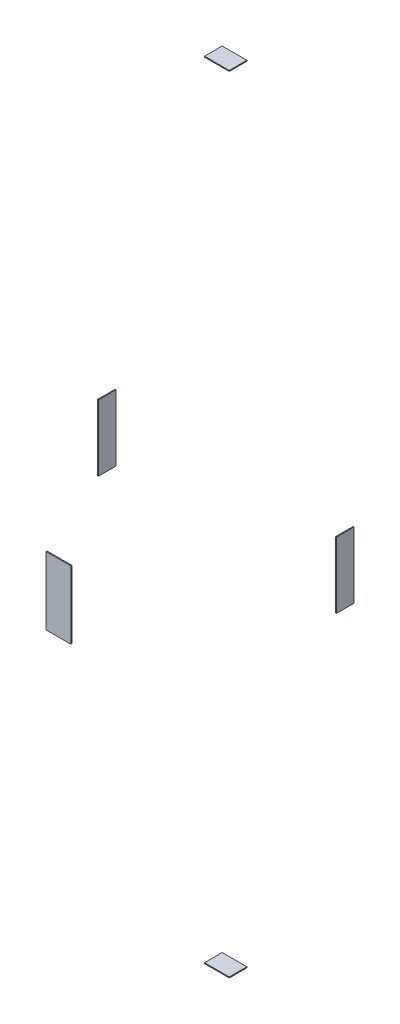
ISO-10303-21;
HEADER;
FILE_DESCRIPTION(('STEP AP214'),'2;1');
FILE_NAME('part.step','',(''),(''),'','','');
FILE_SCHEMA(('AUTOMOTIVE_DESIGN { 1 0 10303 214 1 1 1 1 }'));
ENDSEC;
DATA;
#1=APPLICATION_CONTEXT('core data for automotive mechanical design processes');
#2=APPLICATION_PROTOCOL_DEFINITION('international standard','automotive_design',2000,#1);
#3=PRODUCT_CONTEXT('',#1,'mechanical');
#4=PRODUCT('Part','Part','',(#3));
#5=PRODUCT_RELATED_PRODUCT_CATEGORY('part','',(#4));
#6=PRODUCT_DEFINITION_FORMATION('','',#4);
#7=PRODUCT_DEFINITION_CONTEXT('part definition',#1,'design');
#8=PRODUCT_DEFINITION('design','',#6,#7);
#9=PRODUCT_DEFINITION_SHAPE('','',#8);
#10=(LENGTH_UNIT() NAMED_UNIT(*) SI_UNIT(.MILLI.,.METRE.));
#11=(NAMED_UNIT(*) PLANE_ANGLE_UNIT() SI_UNIT($,.RADIAN.));
#12=(NAMED_UNIT(*) SI_UNIT($,.STERADIAN.) SOLID_ANGLE_UNIT());
#13=UNCERTAINTY_MEASURE_WITH_UNIT(LENGTH_MEASURE(1.E-05),#10,'distance_accuracy_value','');
#14=(GEOMETRIC_REPRESENTATION_CONTEXT(3) GLOBAL_UNCERTAINTY_ASSIGNED_CONTEXT((#13)) GLOBAL_UNIT_ASSIGNED_CONTEXT((#10,
#11,#12)) REPRESENTATION_CONTEXT('',''));
#15=CARTESIAN_POINT('',(0.,0.,0.));
#16=DIRECTION('',(0.,0.,1.));
#17=DIRECTION('',(1.,0.,0.));
#18=AXIS2_PLACEMENT_3D('',#15,#16,#17);
#19=CARTESIAN_POINT('',(-702.764479902639,-5564.23256806933,-420.052202731283));
#20=DIRECTION('',(0.,-1.,0.));
#21=DIRECTION('',(0.,0.,-1.));
#22=AXIS2_PLACEMENT_3D('',#19,#20,#21);
#23=PLANE('',#22);
#24=DIRECTION('',(0.,0.,-1.));
#25=VECTOR('',#24,1.);
#26=CARTESIAN_POINT('',(-781.599422114043,-5564.23256806933,-480.974669701425));
#27=LINE('',#26,#25);
#28=CARTESIAN_POINT('',(-781.599422114043,-5564.23256806933,-452.474669701425));
#29=VERTEX_POINT('',#28);
#30=CARTESIAN_POINT('',(-781.599422114043,-5564.23256806933,-480.974669701425));
#31=VERTEX_POINT('',#30);
#32=EDGE_CURVE('E112',#29,#31,#27,.T.);
#33=ORIENTED_EDGE('',*,*,#32,.F.);
#34=DIRECTION('',(-1.,0.,0.));
#35=VECTOR('',#34,1.);
#36=CARTESIAN_POINT('',(-702.764479902639,-5564.23256806933,-452.474669701425));
#37=LINE('',#36,#35);
#38=CARTESIAN_POINT('',(-780.099422114043,-5564.23256806933,-452.474669701425));
#39=VERTEX_POINT('',#38);
#40=EDGE_CURVE('E62',#39,#29,#37,.T.);
#41=ORIENTED_EDGE('',*,*,#40,.F.);
#42=DIRECTION('',(0.,0.,1.));
#43=VECTOR('',#42,1.);
#44=CARTESIAN_POINT('',(-780.099422114043,-5564.23256806933,-420.052202731283));
#45=LINE('',#44,#43);
#46=CARTESIAN_POINT('',(-780.099422114043,-5564.23256806933,-480.974669701425));
#47=VERTEX_POINT('',#46);
#48=EDGE_CURVE('E13',#47,#39,#45,.T.);
#49=ORIENTED_EDGE('',*,*,#48,.F.);
#50=DIRECTION('',(1.,0.,0.));
#51=VECTOR('',#50,1.);
#52=CARTESIAN_POINT('',(-741.599422114043,-5564.23256806933,-480.974669701425));
#53=LINE('',#52,#51);
#54=EDGE_CURVE('E75',#31,#47,#53,.T.);
#55=ORIENTED_EDGE('',*,*,#54,.F.);
#56=EDGE_LOOP('',(#33,#41,#49,#55));
#57=FACE_BOUND('',#56,.T.);
#58=ADVANCED_FACE('F58',(#57),#23,.F.);
#59=CARTESIAN_POINT('',(-702.764479902639,-5671.23256806933,-420.052202731283));
#60=DIRECTION('',(0.,1.,0.));
#61=DIRECTION('',(0.,0.,1.));
#62=AXIS2_PLACEMENT_3D('',#59,#60,#61);
#63=PLANE('',#62);
#64=DIRECTION('',(0.,0.,1.));
#65=VECTOR('',#64,1.);
#66=CARTESIAN_POINT('',(-781.599422114043,-5671.23256806933,-480.974669701425));
#67=LINE('',#66,#65);
#68=CARTESIAN_POINT('',(-781.599422114043,-5671.23256806933,-480.974669701425));
#69=VERTEX_POINT('',#68);
#70=CARTESIAN_POINT('',(-781.599422114043,-5671.23256806933,-452.474669701425));
#71=VERTEX_POINT('',#70);
#72=EDGE_CURVE('E110',#69,#71,#67,.T.);
#73=ORIENTED_EDGE('',*,*,#72,.F.);
#74=DIRECTION('',(-1.,0.,0.));
#75=VECTOR('',#74,1.);
#76=CARTESIAN_POINT('',(-741.599422114043,-5671.23256806933,-480.974669701425));
#77=LINE('',#76,#75);
#78=CARTESIAN_POINT('',(-780.099422114043,-5671.23256806933,-480.974669701425));
#79=VERTEX_POINT('',#78);
#80=EDGE_CURVE('E107',#79,#69,#77,.T.);
#81=ORIENTED_EDGE('',*,*,#80,.F.);
#82=DIRECTION('',(0.,0.,1.));
#83=VECTOR('',#82,1.);
#84=CARTESIAN_POINT('',(-780.099422114043,-5671.23256806933,-420.052202731283));
#85=LINE('',#84,#83);
#86=CARTESIAN_POINT('',(-780.099422114043,-5671.23256806933,-452.474669701425));
#87=VERTEX_POINT('',#86);
#88=EDGE_CURVE('E99',#79,#87,#85,.T.);
#89=ORIENTED_EDGE('',*,*,#88,.T.);
#90=DIRECTION('',(1.,0.,0.));
#91=VECTOR('',#90,1.);
#92=CARTESIAN_POINT('',(-702.764479902639,-5671.23256806933,-452.474669701425));
#93=LINE('',#92,#91);
#94=EDGE_CURVE('E122',#71,#87,#93,.T.);
#95=ORIENTED_EDGE('',*,*,#94,.F.);
#96=EDGE_LOOP('',(#73,#81,#89,#95));
#97=FACE_BOUND('',#96,.T.);
#98=ADVANCED_FACE('F108',(#97),#63,.F.);
#99=CARTESIAN_POINT('',(-702.764479902639,-5055.9593112624,-452.474669701425));
#100=DIRECTION('',(0.,0.,-1.));
#101=DIRECTION('',(-1.,0.,0.));
#102=AXIS2_PLACEMENT_3D('',#99,#100,#101);
#103=PLANE('',#102);
#104=DIRECTION('',(0.,-1.,0.));
#105=VECTOR('',#104,1.);
#106=CARTESIAN_POINT('',(-780.099422114043,-5562.73256806933,-452.474669701425));
#107=LINE('',#106,#105);
#108=EDGE_CURVE('E67',#39,#87,#107,.T.);
#109=ORIENTED_EDGE('',*,*,#108,.F.);
#110=ORIENTED_EDGE('',*,*,#40,.T.);
#111=DIRECTION('',(0.,1.,0.));
#112=VECTOR('',#111,1.);
#113=CARTESIAN_POINT('',(-781.599422114043,-5562.73256806933,-452.474669701425));
#114=LINE('',#113,#112);
#115=EDGE_CURVE('E116',#71,#29,#114,.T.);
#116=ORIENTED_EDGE('',*,*,#115,.F.);
#117=ORIENTED_EDGE('',*,*,#94,.T.);
#118=EDGE_LOOP('',(#109,#110,#116,#117));
#119=FACE_BOUND('',#118,.T.);
#120=ADVANCED_FACE('F131',(#119),#103,.F.);
#121=CARTESIAN_POINT('',(-741.599422114043,-5562.73256806933,-480.974669701425));
#122=DIRECTION('',(0.,0.,1.));
#123=DIRECTION('',(1.,0.,0.));
#124=AXIS2_PLACEMENT_3D('',#121,#122,#123);
#125=PLANE('',#124);
#126=DIRECTION('',(0.,-1.,0.));
#127=VECTOR('',#126,1.);
#128=CARTESIAN_POINT('',(-781.599422114043,-5562.73256806933,-480.974669701425));
#129=LINE('',#128,#127);
#130=EDGE_CURVE('E113',#31,#69,#129,.T.);
#131=ORIENTED_EDGE('',*,*,#130,.F.);
#132=ORIENTED_EDGE('',*,*,#54,.T.);
#133=DIRECTION('',(0.,-1.,0.));
#134=VECTOR('',#133,1.);
#135=CARTESIAN_POINT('',(-780.099422114043,-5562.73256806933,-480.974669701425));
#136=LINE('',#135,#134);
#137=EDGE_CURVE('E102',#47,#79,#136,.T.);
#138=ORIENTED_EDGE('',*,*,#137,.T.);
#139=ORIENTED_EDGE('',*,*,#80,.T.);
#140=EDGE_LOOP('',(#131,#132,#138,#139));
#141=FACE_BOUND('',#140,.T.);
#142=ADVANCED_FACE('F60',(#141),#125,.F.);
#143=CARTESIAN_POINT('',(-780.099422114043,-5562.73256806933,-480.974669701425));
#144=DIRECTION('',(1.,0.,0.));
#145=DIRECTION('',(0.,0.,-1.));
#146=AXIS2_PLACEMENT_3D('',#143,#144,#145);
#147=PLANE('',#146);
#148=ORIENTED_EDGE('',*,*,#88,.F.);
#149=ORIENTED_EDGE('',*,*,#137,.F.);
#150=ORIENTED_EDGE('',*,*,#48,.T.);
#151=ORIENTED_EDGE('',*,*,#108,.T.);
#152=EDGE_LOOP('',(#148,#149,#150,#151));
#153=FACE_BOUND('',#152,.T.);
#154=ADVANCED_FACE('F101',(#153),#147,.T.);
#155=CARTESIAN_POINT('',(-781.599422114043,-5562.73256806933,-480.974669701425));
#156=DIRECTION('',(1.,0.,0.));
#157=DIRECTION('',(0.,0.,-1.));
#158=AXIS2_PLACEMENT_3D('',#155,#156,#157);
#159=PLANE('',#158);
#160=ORIENTED_EDGE('',*,*,#115,.T.);
#161=ORIENTED_EDGE('',*,*,#32,.T.);
#162=ORIENTED_EDGE('',*,*,#130,.T.);
#163=ORIENTED_EDGE('',*,*,#72,.T.);
#164=EDGE_LOOP('',(#160,#161,#162,#163));
#165=FACE_BOUND('',#164,.T.);
#166=ADVANCED_FACE('F128',(#165),#159,.F.);
#167=CLOSED_SHELL('',(#58,#98,#120,#142,#154,#166));
#168=MANIFOLD_SOLID_BREP('B2',#167);
#169=CARTESIAN_POINT('',(-529.514479902639,-5055.9593112624,-197.512905864621));
#170=DIRECTION('',(0.,0.,-1.));
#171=DIRECTION('',(-1.,0.,0.));
#172=AXIS2_PLACEMENT_3D('',#169,#170,#171);
#173=PLANE('',#172);
#174=DIRECTION('',(0.,1.,0.));
#175=VECTOR('',#174,1.);
#176=CARTESIAN_POINT('',(-608.349422114043,-5562.73256806933,-197.512905864621));
#177=LINE('',#176,#175);
#178=CARTESIAN_POINT('',(-608.349422114043,-5672.73256806933,-197.512905864621));
#179=VERTEX_POINT('',#178);
#180=CARTESIAN_POINT('',(-608.349422114043,-5562.73256806933,-197.512905864621));
#181=VERTEX_POINT('',#180);
#182=EDGE_CURVE('E258',#179,#181,#177,.T.);
#183=ORIENTED_EDGE('',*,*,#182,.T.);
#184=DIRECTION('',(1.,0.,0.));
#185=VECTOR('',#184,1.);
#186=CARTESIAN_POINT('',(-529.514479902639,-5562.73256806933,-197.512905864621));
#187=LINE('',#186,#185);
#188=CARTESIAN_POINT('',(-568.349422114043,-5562.73256806933,-197.512905864621));
#189=VERTEX_POINT('',#188);
#190=EDGE_CURVE('E247',#181,#189,#187,.T.);
#191=ORIENTED_EDGE('',*,*,#190,.T.);
#192=DIRECTION('',(0.,-1.,0.));
#193=VECTOR('',#192,1.);
#194=CARTESIAN_POINT('',(-568.349422114043,-5562.73256806933,-197.512905864621));
#195=LINE('',#194,#193);
#196=CARTESIAN_POINT('',(-568.349422114043,-5672.73256806933,-197.512905864621));
#197=VERTEX_POINT('',#196);
#198=EDGE_CURVE('E254',#189,#197,#195,.T.);
#199=ORIENTED_EDGE('',*,*,#198,.T.);
#200=DIRECTION('',(1.,0.,0.));
#201=VECTOR('',#200,1.);
#202=CARTESIAN_POINT('',(-529.514479902639,-5672.73256806933,-197.512905864621));
#203=LINE('',#202,#201);
#204=EDGE_CURVE('E234',#179,#197,#203,.T.);
#205=ORIENTED_EDGE('',*,*,#204,.F.);
#206=EDGE_LOOP('',(#183,#191,#199,#205));
#207=FACE_BOUND('',#206,.T.);
#208=ADVANCED_FACE('F198',(#207),#173,.T.);
#209=CARTESIAN_POINT('',(-568.349422114043,-5562.73256806933,-196.012905864621));
#210=DIRECTION('',(0.,0.,-1.));
#211=DIRECTION('',(-1.,0.,0.));
#212=AXIS2_PLACEMENT_3D('',#209,#210,#211);
#213=PLANE('',#212);
#214=DIRECTION('',(1.,0.,0.));
#215=VECTOR('',#214,1.);
#216=CARTESIAN_POINT('',(-568.349422114043,-5672.73256806933,-196.012905864621));
#217=LINE('',#216,#215);
#218=CARTESIAN_POINT('',(-608.349422114043,-5672.73256806933,-196.012905864621));
#219=VERTEX_POINT('',#218);
#220=CARTESIAN_POINT('',(-568.349422114043,-5672.73256806933,-196.012905864621));
#221=VERTEX_POINT('',#220);
#222=EDGE_CURVE('E251',#219,#221,#217,.T.);
#223=ORIENTED_EDGE('',*,*,#222,.T.);
#224=DIRECTION('',(0.,-1.,0.));
#225=VECTOR('',#224,1.);
#226=CARTESIAN_POINT('',(-568.349422114043,-5562.73256806933,-196.012905864621));
#227=LINE('',#226,#225);
#228=CARTESIAN_POINT('',(-568.349422114043,-5562.73256806933,-196.012905864621));
#229=VERTEX_POINT('',#228);
#230=EDGE_CURVE('E274',#229,#221,#227,.T.);
#231=ORIENTED_EDGE('',*,*,#230,.F.);
#232=DIRECTION('',(1.,0.,0.));
#233=VECTOR('',#232,1.);
#234=CARTESIAN_POINT('',(-568.349422114043,-5562.73256806933,-196.012905864621));
#235=LINE('',#234,#233);
#236=CARTESIAN_POINT('',(-608.349422114043,-5562.73256806933,-196.012905864621));
#237=VERTEX_POINT('',#236);
#238=EDGE_CURVE('E227',#237,#229,#235,.T.);
#239=ORIENTED_EDGE('',*,*,#238,.F.);
#240=DIRECTION('',(0.,-1.,0.));
#241=VECTOR('',#240,1.);
#242=CARTESIAN_POINT('',(-608.349422114043,-5562.73256806933,-196.012905864621));
#243=LINE('',#242,#241);
#244=EDGE_CURVE('E279',#237,#219,#243,.T.);
#245=ORIENTED_EDGE('',*,*,#244,.T.);
#246=EDGE_LOOP('',(#223,#231,#239,#245));
#247=FACE_BOUND('',#246,.T.);
#248=ADVANCED_FACE('F290',(#247),#213,.F.);
#249=CARTESIAN_POINT('',(-568.349422114043,-5562.73256806933,-226.012905864621));
#250=DIRECTION('',(-1.,0.,0.));
#251=DIRECTION('',(0.,0.,1.));
#252=AXIS2_PLACEMENT_3D('',#249,#250,#251);
#253=PLANE('',#252);
#254=ORIENTED_EDGE('',*,*,#198,.F.);
#255=DIRECTION('',(0.,0.,-1.));
#256=VECTOR('',#255,1.);
#257=CARTESIAN_POINT('',(-568.349422114043,-5562.73256806933,-226.012905864621));
#258=LINE('',#257,#256);
#259=EDGE_CURVE('E244',#229,#189,#258,.T.);
#260=ORIENTED_EDGE('',*,*,#259,.F.);
#261=ORIENTED_EDGE('',*,*,#230,.T.);
#262=DIRECTION('',(0.,0.,-1.));
#263=VECTOR('',#262,1.);
#264=CARTESIAN_POINT('',(-568.349422114043,-5672.73256806933,-226.012905864621));
#265=LINE('',#264,#263);
#266=EDGE_CURVE('E56',#221,#197,#265,.T.);
#267=ORIENTED_EDGE('',*,*,#266,.T.);
#268=EDGE_LOOP('',(#254,#260,#261,#267));
#269=FACE_BOUND('',#268,.T.);
#270=ADVANCED_FACE('F255',(#269),#253,.F.);
#271=CARTESIAN_POINT('',(-608.349422114043,-5562.73256806933,-226.012905864621));
#272=DIRECTION('',(1.,0.,0.));
#273=DIRECTION('',(0.,0.,-1.));
#274=AXIS2_PLACEMENT_3D('',#271,#272,#273);
#275=PLANE('',#274);
#276=ORIENTED_EDGE('',*,*,#182,.F.);
#277=DIRECTION('',(0.,0.,1.));
#278=VECTOR('',#277,1.);
#279=CARTESIAN_POINT('',(-608.349422114043,-5672.73256806933,-226.012905864621));
#280=LINE('',#279,#278);
#281=EDGE_CURVE('E208',#179,#219,#280,.T.);
#282=ORIENTED_EDGE('',*,*,#281,.T.);
#283=ORIENTED_EDGE('',*,*,#244,.F.);
#284=DIRECTION('',(0.,0.,1.));
#285=VECTOR('',#284,1.);
#286=CARTESIAN_POINT('',(-608.349422114043,-5562.73256806933,-226.012905864621));
#287=LINE('',#286,#285);
#288=EDGE_CURVE('E252',#181,#237,#287,.T.);
#289=ORIENTED_EDGE('',*,*,#288,.F.);
#290=EDGE_LOOP('',(#276,#282,#283,#289));
#291=FACE_BOUND('',#290,.T.);
#292=ADVANCED_FACE('F284',(#291),#275,.F.);
#293=CARTESIAN_POINT('',(-529.514479902639,-5672.73256806933,-165.090438894478));
#294=DIRECTION('',(0.,-1.,0.));
#295=DIRECTION('',(0.,0.,-1.));
#296=AXIS2_PLACEMENT_3D('',#293,#294,#295);
#297=PLANE('',#296);
#298=ORIENTED_EDGE('',*,*,#281,.F.);
#299=ORIENTED_EDGE('',*,*,#204,.T.);
#300=ORIENTED_EDGE('',*,*,#266,.F.);
#301=ORIENTED_EDGE('',*,*,#222,.F.);
#302=EDGE_LOOP('',(#298,#299,#300,#301));
#303=FACE_BOUND('',#302,.T.);
#304=ADVANCED_FACE('F282',(#303),#297,.T.);
#305=CARTESIAN_POINT('',(-529.514479902639,-5562.73256806933,-165.090438894479));
#306=DIRECTION('',(0.,-1.,0.));
#307=DIRECTION('',(0.,0.,-1.));
#308=AXIS2_PLACEMENT_3D('',#305,#306,#307);
#309=PLANE('',#308);
#310=ORIENTED_EDGE('',*,*,#190,.F.);
#311=ORIENTED_EDGE('',*,*,#288,.T.);
#312=ORIENTED_EDGE('',*,*,#238,.T.);
#313=ORIENTED_EDGE('',*,*,#259,.T.);
#314=EDGE_LOOP('',(#310,#311,#312,#313));
#315=FACE_BOUND('',#314,.T.);
#316=ADVANCED_FACE('F200',(#315),#309,.F.);
#317=CLOSED_SHELL('',(#208,#248,#270,#292,#304,#316));
#318=MANIFOLD_SOLID_BREP('B7',#317);
#319=CARTESIAN_POINT('',(-356.264479902639,-5564.23256806933,-420.052202731283));
#320=DIRECTION('',(0.,-1.,0.));
#321=DIRECTION('',(0.,0.,-1.));
#322=AXIS2_PLACEMENT_3D('',#319,#320,#321);
#323=PLANE('',#322);
#324=DIRECTION('',(0.,0.,1.));
#325=VECTOR('',#324,1.);
#326=CARTESIAN_POINT('',(-395.099422114043,-5564.23256806933,-480.974669701425));
#327=LINE('',#326,#325);
#328=CARTESIAN_POINT('',(-395.099422114043,-5564.23256806933,-480.974669701425));
#329=VERTEX_POINT('',#328);
#330=CARTESIAN_POINT('',(-395.099422114043,-5564.23256806933,-452.474669701425));
#331=VERTEX_POINT('',#330);
#332=EDGE_CURVE('E421',#329,#331,#327,.T.);
#333=ORIENTED_EDGE('',*,*,#332,.F.);
#334=DIRECTION('',(1.,0.,0.));
#335=VECTOR('',#334,1.);
#336=CARTESIAN_POINT('',(-395.099422114043,-5564.23256806933,-480.974669701425));
#337=LINE('',#336,#335);
#338=CARTESIAN_POINT('',(-396.599422114043,-5564.23256806933,-480.974669701425));
#339=VERTEX_POINT('',#338);
#340=EDGE_CURVE('E361',#339,#329,#337,.T.);
#341=ORIENTED_EDGE('',*,*,#340,.F.);
#342=DIRECTION('',(0.,0.,-1.));
#343=VECTOR('',#342,1.);
#344=CARTESIAN_POINT('',(-396.599422114043,-5564.23256806933,-420.052202731283));
#345=LINE('',#344,#343);
#346=CARTESIAN_POINT('',(-396.599422114043,-5564.23256806933,-452.474669701425));
#347=VERTEX_POINT('',#346);
#348=EDGE_CURVE('E196',#347,#339,#345,.T.);
#349=ORIENTED_EDGE('',*,*,#348,.F.);
#350=DIRECTION('',(-1.,0.,0.));
#351=VECTOR('',#350,1.);
#352=CARTESIAN_POINT('',(-356.264479902639,-5564.23256806933,-452.474669701425));
#353=LINE('',#352,#351);
#354=EDGE_CURVE('E380',#331,#347,#353,.T.);
#355=ORIENTED_EDGE('',*,*,#354,.F.);
#356=EDGE_LOOP('',(#333,#341,#349,#355));
#357=FACE_BOUND('',#356,.T.);
#358=ADVANCED_FACE('F358',(#357),#323,.F.);
#359=CARTESIAN_POINT('',(-356.264479902639,-5671.23256806933,-420.052202731283));
#360=DIRECTION('',(0.,1.,0.));
#361=DIRECTION('',(0.,0.,1.));
#362=AXIS2_PLACEMENT_3D('',#359,#360,#361);
#363=PLANE('',#362);
#364=DIRECTION('',(0.,0.,-1.));
#365=VECTOR('',#364,1.);
#366=CARTESIAN_POINT('',(-395.099422114043,-5671.23256806933,-480.974669701425));
#367=LINE('',#366,#365);
#368=CARTESIAN_POINT('',(-395.099422114043,-5671.23256806933,-452.474669701425));
#369=VERTEX_POINT('',#368);
#370=CARTESIAN_POINT('',(-395.099422114043,-5671.23256806933,-480.974669701425));
#371=VERTEX_POINT('',#370);
#372=EDGE_CURVE('E423',#369,#371,#367,.T.);
#373=ORIENTED_EDGE('',*,*,#372,.F.);
#374=DIRECTION('',(1.,0.,0.));
#375=VECTOR('',#374,1.);
#376=CARTESIAN_POINT('',(-356.264479902639,-5671.23256806933,-452.474669701425));
#377=LINE('',#376,#375);
#378=CARTESIAN_POINT('',(-396.599422114043,-5671.23256806933,-452.474669701425));
#379=VERTEX_POINT('',#378);
#380=EDGE_CURVE('E413',#379,#369,#377,.T.);
#381=ORIENTED_EDGE('',*,*,#380,.F.);
#382=DIRECTION('',(0.,0.,-1.));
#383=VECTOR('',#382,1.);
#384=CARTESIAN_POINT('',(-396.599422114043,-5671.23256806933,-420.052202731283));
#385=LINE('',#384,#383);
#386=CARTESIAN_POINT('',(-396.599422114043,-5671.23256806933,-480.974669701425));
#387=VERTEX_POINT('',#386);
#388=EDGE_CURVE('E411',#379,#387,#385,.T.);
#389=ORIENTED_EDGE('',*,*,#388,.T.);
#390=DIRECTION('',(-1.,0.,0.));
#391=VECTOR('',#390,1.);
#392=CARTESIAN_POINT('',(-395.099422114043,-5671.23256806933,-480.974669701425));
#393=LINE('',#392,#391);
#394=EDGE_CURVE('E400',#371,#387,#393,.T.);
#395=ORIENTED_EDGE('',*,*,#394,.F.);
#396=EDGE_LOOP('',(#373,#381,#389,#395));
#397=FACE_BOUND('',#396,.T.);
#398=ADVANCED_FACE('F412',(#397),#363,.F.);
#399=CARTESIAN_POINT('',(-395.099422114043,-5562.73256806933,-480.974669701425));
#400=DIRECTION('',(-1.,0.,0.));
#401=DIRECTION('',(0.,0.,1.));
#402=AXIS2_PLACEMENT_3D('',#399,#400,#401);
#403=PLANE('',#402);
#404=DIRECTION('',(0.,-1.,0.));
#405=VECTOR('',#404,1.);
#406=CARTESIAN_POINT('',(-395.099422114043,-5562.73256806933,-480.974669701425));
#407=LINE('',#406,#405);
#408=EDGE_CURVE('E404',#329,#371,#407,.T.);
#409=ORIENTED_EDGE('',*,*,#408,.F.);
#410=ORIENTED_EDGE('',*,*,#332,.T.);
#411=DIRECTION('',(0.,-1.,0.));
#412=VECTOR('',#411,1.);
#413=CARTESIAN_POINT('',(-395.099422114043,-5562.73256806933,-452.474669701425));
#414=LINE('',#413,#412);
#415=EDGE_CURVE('E417',#331,#369,#414,.T.);
#416=ORIENTED_EDGE('',*,*,#415,.T.);
#417=ORIENTED_EDGE('',*,*,#372,.T.);
#418=EDGE_LOOP('',(#409,#410,#416,#417));
#419=FACE_BOUND('',#418,.T.);
#420=ADVANCED_FACE('F429',(#419),#403,.F.);
#421=CARTESIAN_POINT('',(-395.099422114043,-5562.73256806933,-480.974669701425));
#422=DIRECTION('',(0.,0.,1.));
#423=DIRECTION('',(1.,0.,0.));
#424=AXIS2_PLACEMENT_3D('',#421,#422,#423);
#425=PLANE('',#424);
#426=DIRECTION('',(0.,-1.,0.));
#427=VECTOR('',#426,1.);
#428=CARTESIAN_POINT('',(-396.599422114043,-5562.73256806933,-480.974669701425));
#429=LINE('',#428,#427);
#430=EDGE_CURVE('E366',#339,#387,#429,.T.);
#431=ORIENTED_EDGE('',*,*,#430,.F.);
#432=ORIENTED_EDGE('',*,*,#340,.T.);
#433=ORIENTED_EDGE('',*,*,#408,.T.);
#434=ORIENTED_EDGE('',*,*,#394,.T.);
#435=EDGE_LOOP('',(#431,#432,#433,#434));
#436=FACE_BOUND('',#435,.T.);
#437=ADVANCED_FACE('F402',(#436),#425,.F.);
#438=CARTESIAN_POINT('',(-356.264479902639,-5055.9593112624,-452.474669701425));
#439=DIRECTION('',(0.,0.,-1.));
#440=DIRECTION('',(-1.,0.,0.));
#441=AXIS2_PLACEMENT_3D('',#438,#439,#440);
#442=PLANE('',#441);
#443=ORIENTED_EDGE('',*,*,#415,.F.);
#444=ORIENTED_EDGE('',*,*,#354,.T.);
#445=DIRECTION('',(0.,-1.,0.));
#446=VECTOR('',#445,1.);
#447=CARTESIAN_POINT('',(-396.599422114043,-5562.73256806933,-452.474669701425));
#448=LINE('',#447,#446);
#449=EDGE_CURVE('E408',#347,#379,#448,.T.);
#450=ORIENTED_EDGE('',*,*,#449,.T.);
#451=ORIENTED_EDGE('',*,*,#380,.T.);
#452=EDGE_LOOP('',(#443,#444,#450,#451));
#453=FACE_BOUND('',#452,.T.);
#454=ADVANCED_FACE('F431',(#453),#442,.F.);
#455=CARTESIAN_POINT('',(-396.599422114043,-5562.73256806933,-480.974669701425));
#456=DIRECTION('',(-1.,0.,0.));
#457=DIRECTION('',(0.,0.,1.));
#458=AXIS2_PLACEMENT_3D('',#455,#456,#457);
#459=PLANE('',#458);
#460=ORIENTED_EDGE('',*,*,#388,.F.);
#461=ORIENTED_EDGE('',*,*,#449,.F.);
#462=ORIENTED_EDGE('',*,*,#348,.T.);
#463=ORIENTED_EDGE('',*,*,#430,.T.);
#464=EDGE_LOOP('',(#460,#461,#462,#463));
#465=FACE_BOUND('',#464,.T.);
#466=ADVANCED_FACE('F415',(#465),#459,.T.);
#467=CLOSED_SHELL('',(#358,#398,#420,#437,#454,#466));
#468=MANIFOLD_SOLID_BREP('B50',#467);
#469=CARTESIAN_POINT('',(-529.514479902639,-4997.90726645064,-420.052202731283));
#470=DIRECTION('',(0.,-1.,0.));
#471=DIRECTION('',(0.,0.,-1.));
#472=AXIS2_PLACEMENT_3D('',#469,#470,#471);
#473=PLANE('',#472);
#474=DIRECTION('',(0.,0.,-1.));
#475=VECTOR('',#474,1.);
#476=CARTESIAN_POINT('',(-608.349422114043,-4997.90726645064,-480.974669701425));
#477=LINE('',#476,#475);
#478=CARTESIAN_POINT('',(-608.349422114043,-4997.90726645064,-452.474669701425));
#479=VERTEX_POINT('',#478);
#480=CARTESIAN_POINT('',(-608.349422114043,-4997.90726645064,-480.974669701425));
#481=VERTEX_POINT('',#480);
#482=EDGE_CURVE('E539',#479,#481,#477,.T.);
#483=ORIENTED_EDGE('',*,*,#482,.T.);
#484=DIRECTION('',(-1.,0.,0.));
#485=VECTOR('',#484,1.);
#486=CARTESIAN_POINT('',(-529.514479902639,-4997.90726645064,-480.974669701425));
#487=LINE('',#486,#485);
#488=CARTESIAN_POINT('',(-568.349422114043,-4997.90726645064,-480.974669701425));
#489=VERTEX_POINT('',#488);
#490=EDGE_CURVE('E356',#489,#481,#487,.T.);
#491=ORIENTED_EDGE('',*,*,#490,.F.);
#492=DIRECTION('',(0.,0.,1.));
#493=VECTOR('',#492,1.);
#494=CARTESIAN_POINT('',(-568.349422114043,-4997.90726645064,-480.974669701425));
#495=LINE('',#494,#493);
#496=CARTESIAN_POINT('',(-568.349422114043,-4997.90726645064,-452.474669701425));
#497=VERTEX_POINT('',#496);
#498=EDGE_CURVE('E500',#489,#497,#495,.T.);
#499=ORIENTED_EDGE('',*,*,#498,.T.);
#500=DIRECTION('',(1.,0.,0.));
#501=VECTOR('',#500,1.);
#502=CARTESIAN_POINT('',(-529.514479902639,-4997.90726645064,-452.474669701425));
#503=LINE('',#502,#501);
#504=EDGE_CURVE('E536',#479,#497,#503,.T.);
#505=ORIENTED_EDGE('',*,*,#504,.F.);
#506=EDGE_LOOP('',(#483,#491,#499,#505));
#507=FACE_BOUND('',#506,.T.);
#508=ADVANCED_FACE('F496',(#507),#473,.T.);
#509=CARTESIAN_POINT('',(-529.514479902639,-4489.63400964371,-452.474669701425));
#510=DIRECTION('',(0.,0.,-1.));
#511=DIRECTION('',(-1.,0.,0.));
#512=AXIS2_PLACEMENT_3D('',#509,#510,#511);
#513=PLANE('',#512);
#514=ORIENTED_EDGE('',*,*,#504,.T.);
#515=DIRECTION('',(0.,-1.,0.));
#516=VECTOR('',#515,1.);
#517=CARTESIAN_POINT('',(-568.349422114043,-4996.40726645064,-452.474669701425));
#518=LINE('',#517,#516);
#519=CARTESIAN_POINT('',(-568.349422114043,-4996.40726645064,-452.474669701425));
#520=VERTEX_POINT('',#519);
#521=EDGE_CURVE('E544',#520,#497,#518,.T.);
#522=ORIENTED_EDGE('',*,*,#521,.F.);
#523=DIRECTION('',(1.,0.,0.));
#524=VECTOR('',#523,1.);
#525=CARTESIAN_POINT('',(-529.514479902639,-4996.40726645064,-452.474669701425));
#526=LINE('',#525,#524);
#527=CARTESIAN_POINT('',(-608.349422114043,-4996.40726645064,-452.474669701425));
#528=VERTEX_POINT('',#527);
#529=EDGE_CURVE('E548',#528,#520,#526,.T.);
#530=ORIENTED_EDGE('',*,*,#529,.F.);
#531=DIRECTION('',(0.,1.,0.));
#532=VECTOR('',#531,1.);
#533=CARTESIAN_POINT('',(-608.349422114043,-4996.40726645064,-452.474669701425));
#534=LINE('',#533,#532);
#535=EDGE_CURVE('E547',#479,#528,#534,.T.);
#536=ORIENTED_EDGE('',*,*,#535,.F.);
#537=EDGE_LOOP('',(#514,#522,#530,#536));
#538=FACE_BOUND('',#537,.T.);
#539=ADVANCED_FACE('F498',(#538),#513,.F.);
#540=CARTESIAN_POINT('',(-568.349422114043,-4996.40726645064,-480.974669701425));
#541=DIRECTION('',(-1.,0.,0.));
#542=DIRECTION('',(0.,0.,1.));
#543=AXIS2_PLACEMENT_3D('',#540,#541,#542);
#544=PLANE('',#543);
#545=ORIENTED_EDGE('',*,*,#498,.F.);
#546=DIRECTION('',(0.,-1.,0.));
#547=VECTOR('',#546,1.);
#548=CARTESIAN_POINT('',(-568.349422114043,-4996.40726645064,-480.974669701425));
#549=LINE('',#548,#547);
#550=CARTESIAN_POINT('',(-568.349422114043,-4996.40726645064,-480.974669701425));
#551=VERTEX_POINT('',#550);
#552=EDGE_CURVE('E558',#551,#489,#549,.T.);
#553=ORIENTED_EDGE('',*,*,#552,.F.);
#554=DIRECTION('',(0.,0.,-1.));
#555=VECTOR('',#554,1.);
#556=CARTESIAN_POINT('',(-568.349422114043,-4996.40726645064,-480.974669701425));
#557=LINE('',#556,#555);
#558=EDGE_CURVE('E505',#520,#551,#557,.T.);
#559=ORIENTED_EDGE('',*,*,#558,.F.);
#560=ORIENTED_EDGE('',*,*,#521,.T.);
#561=EDGE_LOOP('',(#545,#553,#559,#560));
#562=FACE_BOUND('',#561,.T.);
#563=ADVANCED_FACE('F561',(#562),#544,.F.);
#564=CARTESIAN_POINT('',(-568.349422114043,-4996.40726645064,-480.974669701425));
#565=DIRECTION('',(0.,0.,1.));
#566=DIRECTION('',(1.,0.,0.));
#567=AXIS2_PLACEMENT_3D('',#564,#565,#566);
#568=PLANE('',#567);
#569=ORIENTED_EDGE('',*,*,#490,.T.);
#570=DIRECTION('',(0.,-1.,0.));
#571=VECTOR('',#570,1.);
#572=CARTESIAN_POINT('',(-608.349422114043,-4996.40726645064,-480.974669701425));
#573=LINE('',#572,#571);
#574=CARTESIAN_POINT('',(-608.349422114043,-4996.40726645064,-480.974669701425));
#575=VERTEX_POINT('',#574);
#576=EDGE_CURVE('E554',#575,#481,#573,.T.);
#577=ORIENTED_EDGE('',*,*,#576,.F.);
#578=DIRECTION('',(-1.,0.,0.));
#579=VECTOR('',#578,1.);
#580=CARTESIAN_POINT('',(-568.349422114043,-4996.40726645064,-480.974669701425));
#581=LINE('',#580,#579);
#582=EDGE_CURVE('E516',#551,#575,#581,.T.);
#583=ORIENTED_EDGE('',*,*,#582,.F.);
#584=ORIENTED_EDGE('',*,*,#552,.T.);
#585=EDGE_LOOP('',(#569,#577,#583,#584));
#586=FACE_BOUND('',#585,.T.);
#587=ADVANCED_FACE('F574',(#586),#568,.F.);
#588=CARTESIAN_POINT('',(-608.349422114043,-4996.40726645064,-480.974669701425));
#589=DIRECTION('',(1.,0.,0.));
#590=DIRECTION('',(0.,0.,-1.));
#591=AXIS2_PLACEMENT_3D('',#588,#589,#590);
#592=PLANE('',#591);
#593=ORIENTED_EDGE('',*,*,#482,.F.);
#594=ORIENTED_EDGE('',*,*,#535,.T.);
#595=DIRECTION('',(0.,0.,1.));
#596=VECTOR('',#595,1.);
#597=CARTESIAN_POINT('',(-608.349422114043,-4996.40726645064,-480.974669701425));
#598=LINE('',#597,#596);
#599=EDGE_CURVE('E564',#575,#528,#598,.T.);
#600=ORIENTED_EDGE('',*,*,#599,.F.);
#601=ORIENTED_EDGE('',*,*,#576,.T.);
#602=EDGE_LOOP('',(#593,#594,#600,#601));
#603=FACE_BOUND('',#602,.T.);
#604=ADVANCED_FACE('F553',(#603),#592,.F.);
#605=CARTESIAN_POINT('',(-529.514479902639,-4996.40726645064,-420.052202731283));
#606=DIRECTION('',(0.,-1.,0.));
#607=DIRECTION('',(0.,0.,-1.));
#608=AXIS2_PLACEMENT_3D('',#605,#606,#607);
#609=PLANE('',#608);
#610=ORIENTED_EDGE('',*,*,#599,.T.);
#611=ORIENTED_EDGE('',*,*,#529,.T.);
#612=ORIENTED_EDGE('',*,*,#558,.T.);
#613=ORIENTED_EDGE('',*,*,#582,.T.);
#614=EDGE_LOOP('',(#610,#611,#612,#613));
#615=FACE_BOUND('',#614,.T.);
#616=ADVANCED_FACE('F568',(#615),#609,.F.);
#617=CLOSED_SHELL('',(#508,#539,#563,#587,#604,#616));
#618=MANIFOLD_SOLID_BREP('B190',#617);
#619=CARTESIAN_POINT('',(-529.514479902639,-6267.41019089516,-420.052202731283));
#620=DIRECTION('',(0.,-1.,0.));
#621=DIRECTION('',(0.,0.,-1.));
#622=AXIS2_PLACEMENT_3D('',#619,#620,#621);
#623=PLANE('',#622);
#624=DIRECTION('',(1.,0.,0.));
#625=VECTOR('',#624,1.);
#626=CARTESIAN_POINT('',(-529.514479902639,-6267.41019089516,-452.474669701425));
#627=LINE('',#626,#625);
#628=CARTESIAN_POINT('',(-608.349422114043,-6267.41019089516,-452.474669701425));
#629=VERTEX_POINT('',#628);
#630=CARTESIAN_POINT('',(-568.349422114043,-6267.41019089516,-452.474669701425));
#631=VERTEX_POINT('',#630);
#632=EDGE_CURVE('E650',#629,#631,#627,.T.);
#633=ORIENTED_EDGE('',*,*,#632,.T.);
#634=DIRECTION('',(0.,0.,-1.));
#635=VECTOR('',#634,1.);
#636=CARTESIAN_POINT('',(-568.349422114043,-6267.41019089516,-480.974669701425));
#637=LINE('',#636,#635);
#638=CARTESIAN_POINT('',(-568.349422114043,-6267.41019089516,-480.974669701425));
#639=VERTEX_POINT('',#638);
#640=EDGE_CURVE('E639',#631,#639,#637,.T.);
#641=ORIENTED_EDGE('',*,*,#640,.T.);
#642=DIRECTION('',(-1.,0.,0.));
#643=VECTOR('',#642,1.);
#644=CARTESIAN_POINT('',(-529.514479902639,-6267.41019089516,-480.974669701425));
#645=LINE('',#644,#643);
#646=CARTESIAN_POINT('',(-608.349422114043,-6267.41019089516,-480.974669701425));
#647=VERTEX_POINT('',#646);
#648=EDGE_CURVE('E657',#639,#647,#645,.T.);
#649=ORIENTED_EDGE('',*,*,#648,.T.);
#650=DIRECTION('',(0.,0.,1.));
#651=VECTOR('',#650,1.);
#652=CARTESIAN_POINT('',(-608.349422114043,-6267.41019089516,-480.974669701425));
#653=LINE('',#652,#651);
#654=EDGE_CURVE('E494',#647,#629,#653,.T.);
#655=ORIENTED_EDGE('',*,*,#654,.T.);
#656=EDGE_LOOP('',(#633,#641,#649,#655));
#657=FACE_BOUND('',#656,.T.);
#658=ADVANCED_FACE('F635',(#657),#623,.F.);
#659=CARTESIAN_POINT('',(-568.349422114043,-6158.91019089516,-480.974669701425));
#660=DIRECTION('',(-1.,0.,0.));
#661=DIRECTION('',(0.,0.,1.));
#662=AXIS2_PLACEMENT_3D('',#659,#660,#661);
#663=PLANE('',#662);
#664=ORIENTED_EDGE('',*,*,#640,.F.);
#665=DIRECTION('',(0.,-1.,0.));
#666=VECTOR('',#665,1.);
#667=CARTESIAN_POINT('',(-568.349422114043,-6158.91019089516,-452.474669701425));
#668=LINE('',#667,#666);
#669=CARTESIAN_POINT('',(-568.349422114043,-6268.91019089516,-452.474669701425));
#670=VERTEX_POINT('',#669);
#671=EDGE_CURVE('E691',#631,#670,#668,.T.);
#672=ORIENTED_EDGE('',*,*,#671,.T.);
#673=DIRECTION('',(0.,0.,-1.));
#674=VECTOR('',#673,1.);
#675=CARTESIAN_POINT('',(-568.349422114043,-6268.91019089516,-480.974669701425));
#676=LINE('',#675,#674);
#677=CARTESIAN_POINT('',(-568.349422114043,-6268.91019089516,-480.974669701425));
#678=VERTEX_POINT('',#677);
#679=EDGE_CURVE('E689',#670,#678,#676,.T.);
#680=ORIENTED_EDGE('',*,*,#679,.T.);
#681=DIRECTION('',(0.,-1.,0.));
#682=VECTOR('',#681,1.);
#683=CARTESIAN_POINT('',(-568.349422114043,-6158.91019089516,-480.974669701425));
#684=LINE('',#683,#682);
#685=EDGE_CURVE('E677',#639,#678,#684,.T.);
#686=ORIENTED_EDGE('',*,*,#685,.F.);
#687=EDGE_LOOP('',(#664,#672,#680,#686));
#688=FACE_BOUND('',#687,.T.);
#689=ADVANCED_FACE('F690',(#688),#663,.F.);
#690=CARTESIAN_POINT('',(-529.514479902639,-6268.91019089516,-420.052202731283));
#691=DIRECTION('',(0.,-1.,0.));
#692=DIRECTION('',(0.,0.,-1.));
#693=AXIS2_PLACEMENT_3D('',#690,#691,#692);
#694=PLANE('',#693);
#695=DIRECTION('',(1.,0.,0.));
#696=VECTOR('',#695,1.);
#697=CARTESIAN_POINT('',(-529.514479902639,-6268.91019089516,-452.474669701425));
#698=LINE('',#697,#696);
#699=CARTESIAN_POINT('',(-608.349422114043,-6268.91019089516,-452.474669701425));
#700=VERTEX_POINT('',#699);
#701=EDGE_CURVE('E703',#700,#670,#698,.T.);
#702=ORIENTED_EDGE('',*,*,#701,.F.);
#703=DIRECTION('',(0.,0.,1.));
#704=VECTOR('',#703,1.);
#705=CARTESIAN_POINT('',(-608.349422114043,-6268.91019089516,-480.974669701425));
#706=LINE('',#705,#704);
#707=CARTESIAN_POINT('',(-608.349422114043,-6268.91019089516,-480.974669701425));
#708=VERTEX_POINT('',#707);
#709=EDGE_CURVE('E697',#708,#700,#706,.T.);
#710=ORIENTED_EDGE('',*,*,#709,.F.);
#711=DIRECTION('',(-1.,0.,0.));
#712=VECTOR('',#711,1.);
#713=CARTESIAN_POINT('',(-568.349422114043,-6268.91019089516,-480.974669701425));
#714=LINE('',#713,#712);
#715=EDGE_CURVE('E681',#678,#708,#714,.T.);
#716=ORIENTED_EDGE('',*,*,#715,.F.);
#717=ORIENTED_EDGE('',*,*,#679,.F.);
#718=EDGE_LOOP('',(#702,#710,#716,#717));
#719=FACE_BOUND('',#718,.T.);
#720=ADVANCED_FACE('F695',(#719),#694,.T.);
#721=CARTESIAN_POINT('',(-608.349422114043,-6158.91019089516,-480.974669701425));
#722=DIRECTION('',(1.,0.,0.));
#723=DIRECTION('',(0.,0.,-1.));
#724=AXIS2_PLACEMENT_3D('',#721,#722,#723);
#725=PLANE('',#724);
#726=ORIENTED_EDGE('',*,*,#654,.F.);
#727=DIRECTION('',(0.,-1.,0.));
#728=VECTOR('',#727,1.);
#729=CARTESIAN_POINT('',(-608.349422114043,-6158.91019089516,-480.974669701425));
#730=LINE('',#729,#728);
#731=EDGE_CURVE('E686',#647,#708,#730,.T.);
#732=ORIENTED_EDGE('',*,*,#731,.T.);
#733=ORIENTED_EDGE('',*,*,#709,.T.);
#734=DIRECTION('',(0.,1.,0.));
#735=VECTOR('',#734,1.);
#736=CARTESIAN_POINT('',(-608.349422114043,-6158.91019089516,-452.474669701425));
#737=LINE('',#736,#735);
#738=EDGE_CURVE('E685',#700,#629,#737,.T.);
#739=ORIENTED_EDGE('',*,*,#738,.T.);
#740=EDGE_LOOP('',(#726,#732,#733,#739));
#741=FACE_BOUND('',#740,.T.);
#742=ADVANCED_FACE('F708',(#741),#725,.F.);
#743=CARTESIAN_POINT('',(-529.514479902639,-5652.13693408823,-452.474669701425));
#744=DIRECTION('',(0.,0.,-1.));
#745=DIRECTION('',(-1.,0.,0.));
#746=AXIS2_PLACEMENT_3D('',#743,#744,#745);
#747=PLANE('',#746);
#748=ORIENTED_EDGE('',*,*,#632,.F.);
#749=ORIENTED_EDGE('',*,*,#738,.F.);
#750=ORIENTED_EDGE('',*,*,#701,.T.);
#751=ORIENTED_EDGE('',*,*,#671,.F.);
#752=EDGE_LOOP('',(#748,#749,#750,#751));
#753=FACE_BOUND('',#752,.T.);
#754=ADVANCED_FACE('F637',(#753),#747,.F.);
#755=CARTESIAN_POINT('',(-568.349422114043,-6158.91019089516,-480.974669701425));
#756=DIRECTION('',(0.,0.,1.));
#757=DIRECTION('',(1.,0.,0.));
#758=AXIS2_PLACEMENT_3D('',#755,#756,#757);
#759=PLANE('',#758);
#760=ORIENTED_EDGE('',*,*,#648,.F.);
#761=ORIENTED_EDGE('',*,*,#685,.T.);
#762=ORIENTED_EDGE('',*,*,#715,.T.);
#763=ORIENTED_EDGE('',*,*,#731,.F.);
#764=EDGE_LOOP('',(#760,#761,#762,#763));
#765=FACE_BOUND('',#764,.T.);
#766=ADVANCED_FACE('F679',(#765),#759,.F.);
#767=CLOSED_SHELL('',(#658,#689,#720,#742,#754,#766));
#768=MANIFOLD_SOLID_BREP('B350',#767);
#769=ADVANCED_BREP_SHAPE_REPRESENTATION('',(#18,#168,#318,#468,#618,#768),#14);
#770=SHAPE_DEFINITION_REPRESENTATION(#9,#769);
ENDSEC;
END-ISO-10303-21;
